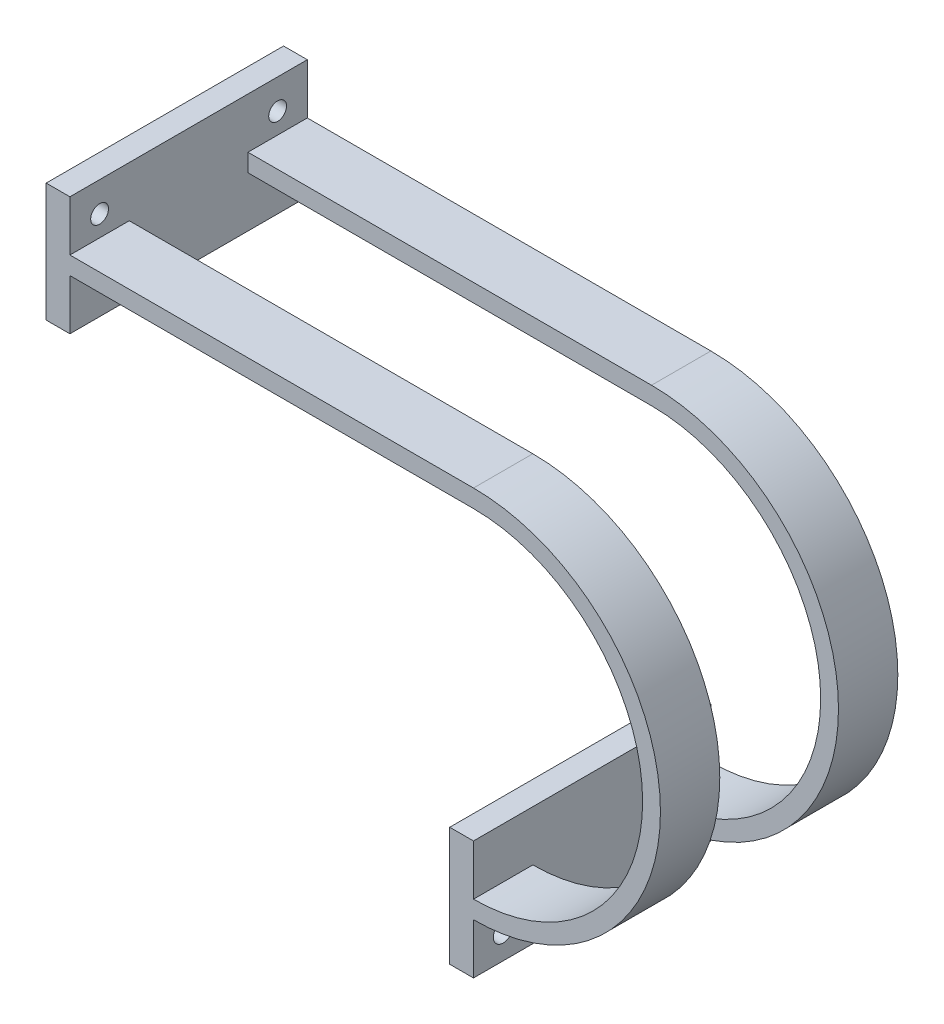
ISO-10303-21;
HEADER;
FILE_DESCRIPTION(('STEP AP214'),'2;1');
FILE_NAME('part.step','',(''),(''),'','','');
FILE_SCHEMA(('AUTOMOTIVE_DESIGN { 1 0 10303 214 1 1 1 1 }'));
ENDSEC;
DATA;
#1=APPLICATION_CONTEXT('core data for automotive mechanical design processes');
#2=APPLICATION_PROTOCOL_DEFINITION('international standard','automotive_design',2000,#1);
#3=PRODUCT_CONTEXT('',#1,'mechanical');
#4=PRODUCT('Part','Part','',(#3));
#5=PRODUCT_RELATED_PRODUCT_CATEGORY('part','',(#4));
#6=PRODUCT_DEFINITION_FORMATION('','',#4);
#7=PRODUCT_DEFINITION_CONTEXT('part definition',#1,'design');
#8=PRODUCT_DEFINITION('design','',#6,#7);
#9=PRODUCT_DEFINITION_SHAPE('','',#8);
#10=(LENGTH_UNIT() NAMED_UNIT(*) SI_UNIT(.MILLI.,.METRE.));
#11=(NAMED_UNIT(*) PLANE_ANGLE_UNIT() SI_UNIT($,.RADIAN.));
#12=(NAMED_UNIT(*) SI_UNIT($,.STERADIAN.) SOLID_ANGLE_UNIT());
#13=UNCERTAINTY_MEASURE_WITH_UNIT(LENGTH_MEASURE(1.E-05),#10,'distance_accuracy_value','');
#14=(GEOMETRIC_REPRESENTATION_CONTEXT(3) GLOBAL_UNCERTAINTY_ASSIGNED_CONTEXT((#13)) GLOBAL_UNIT_ASSIGNED_CONTEXT((#10,
#11,#12)) REPRESENTATION_CONTEXT('',''));
#15=CARTESIAN_POINT('',(0.,0.,0.));
#16=DIRECTION('',(0.,0.,1.));
#17=DIRECTION('',(1.,0.,0.));
#18=AXIS2_PLACEMENT_3D('',#15,#16,#17);
#19=CARTESIAN_POINT('',(139.59612732993,1607.92169688137,-1159.50626659985));
#20=DIRECTION('',(0.,0.,-1.));
#21=DIRECTION('',(-1.,0.,0.));
#22=AXIS2_PLACEMENT_3D('',#19,#20,#21);
#23=CYLINDRICAL_SURFACE('',#22,15.7499999999997);
#24=CARTESIAN_POINT('',(139.59612732993,1607.92169688137,-1209.72433724547));
#25=DIRECTION('',(0.,0.,-1.));
#26=DIRECTION('',(-1.,0.,0.));
#27=AXIS2_PLACEMENT_3D('',#24,#25,#26);
#28=CIRCLE('',#27,15.7499999999997);
#29=CARTESIAN_POINT('',(139.596127329932,1592.17169688137,-1209.72433724547));
#30=VERTEX_POINT('',#29);
#31=CARTESIAN_POINT('',(139.596127329932,1623.67169688137,-1209.72433724547));
#32=VERTEX_POINT('',#31);
#33=EDGE_CURVE('E186',#30,#32,#28,.F.);
#34=ORIENTED_EDGE('',*,*,#33,.F.);
#35=DIRECTION('',(0.,0.,-1.));
#36=VECTOR('',#35,1.);
#37=CARTESIAN_POINT('',(139.59612732993,1592.17169688137,-1159.50626659985));
#38=LINE('',#37,#36);
#39=CARTESIAN_POINT('',(139.59612732993,1592.17169688137,-1214.72433724547));
#40=VERTEX_POINT('',#39);
#41=EDGE_CURVE('E202',#30,#40,#38,.T.);
#42=ORIENTED_EDGE('',*,*,#41,.T.);
#43=CARTESIAN_POINT('',(139.59612732993,1607.92169688137,-1214.72433724547));
#44=DIRECTION('',(0.,0.,-1.));
#45=DIRECTION('',(1.,0.,0.));
#46=AXIS2_PLACEMENT_3D('',#43,#44,#45);
#47=CIRCLE('',#46,15.7499999999997);
#48=CARTESIAN_POINT('',(139.59612732993,1623.67169688137,-1214.72433724547));
#49=VERTEX_POINT('',#48);
#50=EDGE_CURVE('E333',#49,#40,#47,.T.);
#51=ORIENTED_EDGE('',*,*,#50,.F.);
#52=DIRECTION('',(0.,0.,1.));
#53=VECTOR('',#52,1.);
#54=CARTESIAN_POINT('',(139.59612732993,1623.67169688137,-1214.72433724547));
#55=LINE('',#54,#53);
#56=EDGE_CURVE('E264',#49,#32,#55,.T.);
#57=ORIENTED_EDGE('',*,*,#56,.T.);
#58=EDGE_LOOP('',(#34,#42,#51,#57));
#59=FACE_BOUND('',#58,.T.);
#60=ADVANCED_FACE('F41',(#59),#23,.T.);
#61=CARTESIAN_POINT('',(139.59612732993,1607.92169688137,-1159.50626659985));
#62=DIRECTION('',(0.,0.,-1.));
#63=DIRECTION('',(-1.,0.,0.));
#64=AXIS2_PLACEMENT_3D('',#61,#62,#63);
#65=CYLINDRICAL_SURFACE('',#64,14.2499999999999);
#66=CARTESIAN_POINT('',(139.59612732993,1607.92169688137,-1209.72433724547));
#67=DIRECTION('',(0.,0.,-1.));
#68=DIRECTION('',(-1.,0.,0.));
#69=AXIS2_PLACEMENT_3D('',#66,#67,#68);
#70=CIRCLE('',#69,14.2499999999999);
#71=CARTESIAN_POINT('',(139.596127329932,1622.17169688137,-1209.72433724547));
#72=VERTEX_POINT('',#71);
#73=CARTESIAN_POINT('',(139.596127329932,1593.67169688137,-1209.72433724547));
#74=VERTEX_POINT('',#73);
#75=EDGE_CURVE('E11',#72,#74,#70,.T.);
#76=ORIENTED_EDGE('',*,*,#75,.F.);
#77=DIRECTION('',(0.,0.,-1.));
#78=VECTOR('',#77,1.);
#79=CARTESIAN_POINT('',(139.59612732993,1622.17169688137,-1214.72433724547));
#80=LINE('',#79,#78);
#81=CARTESIAN_POINT('',(139.59612732993,1622.17169688137,-1214.72433724547));
#82=VERTEX_POINT('',#81);
#83=EDGE_CURVE('E297',#72,#82,#80,.T.);
#84=ORIENTED_EDGE('',*,*,#83,.T.);
#85=CARTESIAN_POINT('',(139.59612732993,1607.92169688137,-1214.72433724547));
#86=DIRECTION('',(0.,0.,1.));
#87=DIRECTION('',(1.,0.,0.));
#88=AXIS2_PLACEMENT_3D('',#85,#86,#87);
#89=CIRCLE('',#88,14.2499999999999);
#90=CARTESIAN_POINT('',(139.59612732993,1593.67169688137,-1214.72433724547));
#91=VERTEX_POINT('',#90);
#92=EDGE_CURVE('E207',#91,#82,#89,.T.);
#93=ORIENTED_EDGE('',*,*,#92,.F.);
#94=DIRECTION('',(0.,0.,-1.));
#95=VECTOR('',#94,1.);
#96=CARTESIAN_POINT('',(139.59612732993,1593.67169688137,-1159.50626659985));
#97=LINE('',#96,#95);
#98=EDGE_CURVE('E66',#74,#91,#97,.T.);
#99=ORIENTED_EDGE('',*,*,#98,.F.);
#100=EDGE_LOOP('',(#76,#84,#93,#99));
#101=FACE_BOUND('',#100,.T.);
#102=ADVANCED_FACE('F406',(#101),#65,.F.);
#103=CARTESIAN_POINT('',(139.59612732993,1587.92169688137,-1194.72433724547));
#104=DIRECTION('',(0.,0.,-1.));
#105=DIRECTION('',(-1.,0.,0.));
#106=AXIS2_PLACEMENT_3D('',#103,#104,#105);
#107=PLANE('',#106);
#108=DIRECTION('',(0.,-1.,0.));
#109=VECTOR('',#108,1.);
#110=CARTESIAN_POINT('',(137.59612732993,1587.92169688137,-1194.72433724547));
#111=LINE('',#110,#109);
#112=CARTESIAN_POINT('',(137.59612732993,1597.92169688137,-1194.72433724547));
#113=VERTEX_POINT('',#112);
#114=CARTESIAN_POINT('',(137.59612732993,1587.92169688137,-1194.72433724547));
#115=VERTEX_POINT('',#114);
#116=EDGE_CURVE('E222',#113,#115,#111,.T.);
#117=ORIENTED_EDGE('',*,*,#116,.T.);
#118=DIRECTION('',(-1.,0.,0.));
#119=VECTOR('',#118,1.);
#120=CARTESIAN_POINT('',(139.59612732993,1587.92169688137,-1194.72433724547));
#121=LINE('',#120,#119);
#122=CARTESIAN_POINT('',(139.59612732993,1587.92169688137,-1194.72433724547));
#123=VERTEX_POINT('',#122);
#124=EDGE_CURVE('E239',#123,#115,#121,.T.);
#125=ORIENTED_EDGE('',*,*,#124,.F.);
#126=DIRECTION('',(0.,-1.,0.));
#127=VECTOR('',#126,1.);
#128=CARTESIAN_POINT('',(139.59612732993,1587.92169688137,-1194.72433724547));
#129=LINE('',#128,#127);
#130=CARTESIAN_POINT('',(139.59612732993,1592.17169688137,-1194.72433724547));
#131=VERTEX_POINT('',#130);
#132=EDGE_CURVE('E212',#131,#123,#129,.T.);
#133=ORIENTED_EDGE('',*,*,#132,.F.);
#134=CARTESIAN_POINT('',(139.59612732993,1607.92169688137,-1194.72433724547));
#135=DIRECTION('',(0.,0.,-1.));
#136=DIRECTION('',(-1.,0.,0.));
#137=AXIS2_PLACEMENT_3D('',#134,#135,#136);
#138=CIRCLE('',#137,15.7499999999997);
#139=CARTESIAN_POINT('',(139.59612732993,1623.67169688137,-1194.72433724547));
#140=VERTEX_POINT('',#139);
#141=EDGE_CURVE('E205',#131,#140,#138,.F.);
#142=ORIENTED_EDGE('',*,*,#141,.T.);
#143=DIRECTION('',(1.,0.,0.));
#144=VECTOR('',#143,1.);
#145=CARTESIAN_POINT('',(100.375974075477,1623.67169688137,-1194.72433724547));
#146=LINE('',#145,#144);
#147=CARTESIAN_POINT('',(105.596127329933,1623.67169688137,-1194.72433724547));
#148=VERTEX_POINT('',#147);
#149=EDGE_CURVE('E268',#148,#140,#146,.T.);
#150=ORIENTED_EDGE('',*,*,#149,.F.);
#151=DIRECTION('',(0.,-1.,0.));
#152=VECTOR('',#151,1.);
#153=CARTESIAN_POINT('',(105.596127329933,1617.92169688137,-1194.72433724547));
#154=LINE('',#153,#152);
#155=CARTESIAN_POINT('',(105.596127329933,1627.92169688137,-1194.72433724547));
#156=VERTEX_POINT('',#155);
#157=EDGE_CURVE('E310',#156,#148,#154,.T.);
#158=ORIENTED_EDGE('',*,*,#157,.F.);
#159=DIRECTION('',(-1.,0.,0.));
#160=VECTOR('',#159,1.);
#161=CARTESIAN_POINT('',(105.596127329933,1627.92169688137,-1194.72433724547));
#162=LINE('',#161,#160);
#163=CARTESIAN_POINT('',(103.596127329933,1627.92169688137,-1194.72433724547));
#164=VERTEX_POINT('',#163);
#165=EDGE_CURVE('E323',#156,#164,#162,.T.);
#166=ORIENTED_EDGE('',*,*,#165,.T.);
#167=DIRECTION('',(0.,-1.,0.));
#168=VECTOR('',#167,1.);
#169=CARTESIAN_POINT('',(103.596127329933,1617.92169688137,-1194.72433724547));
#170=LINE('',#169,#168);
#171=CARTESIAN_POINT('',(103.596127329933,1617.92169688137,-1194.72433724547));
#172=VERTEX_POINT('',#171);
#173=EDGE_CURVE('E316',#164,#172,#170,.T.);
#174=ORIENTED_EDGE('',*,*,#173,.T.);
#175=DIRECTION('',(-1.,0.,0.));
#176=VECTOR('',#175,1.);
#177=CARTESIAN_POINT('',(105.596127329933,1617.92169688137,-1194.72433724547));
#178=LINE('',#177,#176);
#179=CARTESIAN_POINT('',(105.596127329933,1617.92169688137,-1194.72433724547));
#180=VERTEX_POINT('',#179);
#181=EDGE_CURVE('E325',#180,#172,#178,.T.);
#182=ORIENTED_EDGE('',*,*,#181,.F.);
#183=CARTESIAN_POINT('',(105.596127329933,1622.17169688137,-1194.72433724547));
#184=VERTEX_POINT('',#183);
#185=EDGE_CURVE('E307',#184,#180,#154,.T.);
#186=ORIENTED_EDGE('',*,*,#185,.F.);
#187=DIRECTION('',(1.,0.,0.));
#188=VECTOR('',#187,1.);
#189=CARTESIAN_POINT('',(100.375974075477,1622.17169688137,-1194.72433724547));
#190=LINE('',#189,#188);
#191=CARTESIAN_POINT('',(139.59612732993,1622.17169688137,-1194.72433724547));
#192=VERTEX_POINT('',#191);
#193=EDGE_CURVE('E275',#184,#192,#190,.T.);
#194=ORIENTED_EDGE('',*,*,#193,.T.);
#195=CARTESIAN_POINT('',(139.59612732993,1607.92169688137,-1194.72433724547));
#196=DIRECTION('',(0.,0.,-1.));
#197=DIRECTION('',(-1.,0.,0.));
#198=AXIS2_PLACEMENT_3D('',#195,#196,#197);
#199=CIRCLE('',#198,14.2499999999999);
#200=CARTESIAN_POINT('',(139.59612732993,1593.67169688137,-1194.72433724547));
#201=VERTEX_POINT('',#200);
#202=EDGE_CURVE('E332',#192,#201,#199,.T.);
#203=ORIENTED_EDGE('',*,*,#202,.T.);
#204=CARTESIAN_POINT('',(139.59612732993,1597.92169688137,-1194.72433724547));
#205=VERTEX_POINT('',#204);
#206=EDGE_CURVE('E206',#205,#201,#129,.T.);
#207=ORIENTED_EDGE('',*,*,#206,.F.);
#208=DIRECTION('',(-1.,0.,0.));
#209=VECTOR('',#208,1.);
#210=CARTESIAN_POINT('',(139.59612732993,1597.92169688137,-1194.72433724547));
#211=LINE('',#210,#209);
#212=EDGE_CURVE('E219',#205,#113,#211,.T.);
#213=ORIENTED_EDGE('',*,*,#212,.T.);
#214=EDGE_LOOP('',(#117,#125,#133,#142,#150,#158,#166,#174,#182,#186,#194,#203,#207,#213));
#215=FACE_BOUND('',#214,.T.);
#216=ADVANCED_FACE('F43',(#215),#107,.F.);
#217=CARTESIAN_POINT('',(139.59612732993,1587.92169688137,-1214.72433724547));
#218=DIRECTION('',(0.,1.,0.));
#219=DIRECTION('',(0.,0.,1.));
#220=AXIS2_PLACEMENT_3D('',#217,#218,#219);
#221=PLANE('',#220);
#222=DIRECTION('',(0.,0.,-1.));
#223=VECTOR('',#222,1.);
#224=CARTESIAN_POINT('',(137.59612732993,1587.92169688137,-1214.72433724547));
#225=LINE('',#224,#223);
#226=CARTESIAN_POINT('',(137.59612732993,1587.92169688137,-1214.72433724547));
#227=VERTEX_POINT('',#226);
#228=EDGE_CURVE('E221',#115,#227,#225,.T.);
#229=ORIENTED_EDGE('',*,*,#228,.T.);
#230=DIRECTION('',(-1.,0.,0.));
#231=VECTOR('',#230,1.);
#232=CARTESIAN_POINT('',(139.59612732993,1587.92169688137,-1214.72433724547));
#233=LINE('',#232,#231);
#234=CARTESIAN_POINT('',(139.59612732993,1587.92169688137,-1214.72433724547));
#235=VERTEX_POINT('',#234);
#236=EDGE_CURVE('E233',#235,#227,#233,.T.);
#237=ORIENTED_EDGE('',*,*,#236,.F.);
#238=DIRECTION('',(0.,0.,-1.));
#239=VECTOR('',#238,1.);
#240=CARTESIAN_POINT('',(139.59612732993,1587.92169688137,-1214.72433724547));
#241=LINE('',#240,#239);
#242=EDGE_CURVE('E211',#123,#235,#241,.T.);
#243=ORIENTED_EDGE('',*,*,#242,.F.);
#244=ORIENTED_EDGE('',*,*,#124,.T.);
#245=EDGE_LOOP('',(#229,#237,#243,#244));
#246=FACE_BOUND('',#245,.T.);
#247=ADVANCED_FACE('F362',(#246),#221,.F.);
#248=CARTESIAN_POINT('',(139.59612732993,1587.92169688137,-1214.72433724547));
#249=DIRECTION('',(0.,0.,1.));
#250=DIRECTION('',(1.,0.,0.));
#251=AXIS2_PLACEMENT_3D('',#248,#249,#250);
#252=PLANE('',#251);
#253=DIRECTION('',(0.,1.,0.));
#254=VECTOR('',#253,1.);
#255=CARTESIAN_POINT('',(137.59612732993,1587.92169688137,-1214.72433724547));
#256=LINE('',#255,#254);
#257=CARTESIAN_POINT('',(137.59612732993,1597.92169688137,-1214.72433724547));
#258=VERTEX_POINT('',#257);
#259=EDGE_CURVE('E227',#227,#258,#256,.T.);
#260=ORIENTED_EDGE('',*,*,#259,.T.);
#261=DIRECTION('',(-1.,0.,0.));
#262=VECTOR('',#261,1.);
#263=CARTESIAN_POINT('',(139.59612732993,1597.92169688137,-1214.72433724547));
#264=LINE('',#263,#262);
#265=CARTESIAN_POINT('',(139.59612732993,1597.92169688137,-1214.72433724547));
#266=VERTEX_POINT('',#265);
#267=EDGE_CURVE('E235',#266,#258,#264,.T.);
#268=ORIENTED_EDGE('',*,*,#267,.F.);
#269=DIRECTION('',(0.,1.,0.));
#270=VECTOR('',#269,1.);
#271=CARTESIAN_POINT('',(139.59612732993,1587.92169688137,-1214.72433724547));
#272=LINE('',#271,#270);
#273=EDGE_CURVE('E213',#91,#266,#272,.T.);
#274=ORIENTED_EDGE('',*,*,#273,.F.);
#275=ORIENTED_EDGE('',*,*,#92,.T.);
#276=DIRECTION('',(1.,0.,0.));
#277=VECTOR('',#276,1.);
#278=CARTESIAN_POINT('',(100.375974075477,1622.17169688137,-1214.72433724547));
#279=LINE('',#278,#277);
#280=CARTESIAN_POINT('',(105.596127329933,1622.17169688137,-1214.72433724547));
#281=VERTEX_POINT('',#280);
#282=EDGE_CURVE('E278',#281,#82,#279,.T.);
#283=ORIENTED_EDGE('',*,*,#282,.F.);
#284=DIRECTION('',(0.,1.,0.));
#285=VECTOR('',#284,1.);
#286=CARTESIAN_POINT('',(105.596127329933,1617.92169688137,-1214.72433724547));
#287=LINE('',#286,#285);
#288=CARTESIAN_POINT('',(105.596127329933,1617.92169688137,-1214.72433724547));
#289=VERTEX_POINT('',#288);
#290=EDGE_CURVE('E302',#289,#281,#287,.T.);
#291=ORIENTED_EDGE('',*,*,#290,.F.);
#292=DIRECTION('',(-1.,0.,0.));
#293=VECTOR('',#292,1.);
#294=CARTESIAN_POINT('',(105.596127329933,1617.92169688137,-1214.72433724547));
#295=LINE('',#294,#293);
#296=CARTESIAN_POINT('',(103.596127329933,1617.92169688137,-1214.72433724547));
#297=VERTEX_POINT('',#296);
#298=EDGE_CURVE('E311',#289,#297,#295,.T.);
#299=ORIENTED_EDGE('',*,*,#298,.T.);
#300=DIRECTION('',(0.,1.,0.));
#301=VECTOR('',#300,1.);
#302=CARTESIAN_POINT('',(103.596127329933,1617.92169688137,-1214.72433724547));
#303=LINE('',#302,#301);
#304=CARTESIAN_POINT('',(103.596127329933,1627.92169688137,-1214.72433724547));
#305=VERTEX_POINT('',#304);
#306=EDGE_CURVE('E280',#297,#305,#303,.T.);
#307=ORIENTED_EDGE('',*,*,#306,.T.);
#308=DIRECTION('',(-1.,0.,0.));
#309=VECTOR('',#308,1.);
#310=CARTESIAN_POINT('',(105.596127329933,1627.92169688137,-1214.72433724547));
#311=LINE('',#310,#309);
#312=CARTESIAN_POINT('',(105.596127329933,1627.92169688137,-1214.72433724547));
#313=VERTEX_POINT('',#312);
#314=EDGE_CURVE('E328',#313,#305,#311,.T.);
#315=ORIENTED_EDGE('',*,*,#314,.F.);
#316=CARTESIAN_POINT('',(105.596127329933,1623.67169688137,-1214.72433724547));
#317=VERTEX_POINT('',#316);
#318=EDGE_CURVE('E304',#317,#313,#287,.T.);
#319=ORIENTED_EDGE('',*,*,#318,.F.);
#320=DIRECTION('',(1.,0.,0.));
#321=VECTOR('',#320,1.);
#322=CARTESIAN_POINT('',(100.375974075477,1623.67169688137,-1214.72433724547));
#323=LINE('',#322,#321);
#324=EDGE_CURVE('E260',#317,#49,#323,.T.);
#325=ORIENTED_EDGE('',*,*,#324,.T.);
#326=ORIENTED_EDGE('',*,*,#50,.T.);
#327=EDGE_CURVE('E215',#235,#40,#272,.T.);
#328=ORIENTED_EDGE('',*,*,#327,.F.);
#329=ORIENTED_EDGE('',*,*,#236,.T.);
#330=EDGE_LOOP('',(#260,#268,#274,#275,#283,#291,#299,#307,#315,#319,#325,#326,#328,#329));
#331=FACE_BOUND('',#330,.T.);
#332=ADVANCED_FACE('F366',(#331),#252,.F.);
#333=CARTESIAN_POINT('',(139.59612732993,1597.92169688137,-1214.72433724547));
#334=DIRECTION('',(0.,-1.,0.));
#335=DIRECTION('',(0.,0.,-1.));
#336=AXIS2_PLACEMENT_3D('',#333,#334,#335);
#337=PLANE('',#336);
#338=DIRECTION('',(0.,0.,1.));
#339=VECTOR('',#338,1.);
#340=CARTESIAN_POINT('',(137.59612732993,1597.92169688137,-1214.72433724547));
#341=LINE('',#340,#339);
#342=EDGE_CURVE('E228',#258,#113,#341,.T.);
#343=ORIENTED_EDGE('',*,*,#342,.T.);
#344=ORIENTED_EDGE('',*,*,#212,.F.);
#345=DIRECTION('',(0.,0.,1.));
#346=VECTOR('',#345,1.);
#347=CARTESIAN_POINT('',(139.59612732993,1597.92169688137,-1214.72433724547));
#348=LINE('',#347,#346);
#349=EDGE_CURVE('E217',#266,#205,#348,.T.);
#350=ORIENTED_EDGE('',*,*,#349,.F.);
#351=ORIENTED_EDGE('',*,*,#267,.T.);
#352=EDGE_LOOP('',(#343,#344,#350,#351));
#353=FACE_BOUND('',#352,.T.);
#354=ADVANCED_FACE('F405',(#353),#337,.F.);
#355=CARTESIAN_POINT('',(139.59612732993,0.,0.));
#356=DIRECTION('',(1.,0.,0.));
#357=DIRECTION('',(0.,0.,-1.));
#358=AXIS2_PLACEMENT_3D('',#355,#356,#357);
#359=PLANE('',#358);
#360=CARTESIAN_POINT('',(139.59612732993,1590.04669688137,-1197.22433724547));
#361=DIRECTION('',(1.,0.,0.));
#362=DIRECTION('',(0.,0.,-1.));
#363=AXIS2_PLACEMENT_3D('',#360,#361,#362);
#364=CIRCLE('',#363,0.825000000000161);
#365=CARTESIAN_POINT('',(139.59612732993,1590.04669688137,-1198.04933724547));
#366=VERTEX_POINT('',#365);
#367=EDGE_CURVE('E242',#366,#366,#364,.T.);
#368=ORIENTED_EDGE('',*,*,#367,.F.);
#369=EDGE_LOOP('',(#368));
#370=FACE_BOUND('',#369,.T.);
#371=CARTESIAN_POINT('',(139.59612732993,1590.04669688137,-1212.22433724547));
#372=DIRECTION('',(1.,0.,0.));
#373=DIRECTION('',(0.,0.,-1.));
#374=AXIS2_PLACEMENT_3D('',#371,#372,#373);
#375=CIRCLE('',#374,0.825000000000161);
#376=CARTESIAN_POINT('',(139.59612732993,1590.04669688137,-1213.04933724547));
#377=VERTEX_POINT('',#376);
#378=EDGE_CURVE('E249',#377,#377,#375,.T.);
#379=ORIENTED_EDGE('',*,*,#378,.F.);
#380=EDGE_LOOP('',(#379));
#381=FACE_BOUND('',#380,.T.);
#382=ORIENTED_EDGE('',*,*,#41,.F.);
#383=DIRECTION('',(0.,1.,0.));
#384=VECTOR('',#383,1.);
#385=CARTESIAN_POINT('',(139.596127329932,1577.92169688137,-1209.72433724547));
#386=LINE('',#385,#384);
#387=EDGE_CURVE('E189',#30,#74,#386,.T.);
#388=ORIENTED_EDGE('',*,*,#387,.T.);
#389=ORIENTED_EDGE('',*,*,#98,.T.);
#390=ORIENTED_EDGE('',*,*,#273,.T.);
#391=ORIENTED_EDGE('',*,*,#349,.T.);
#392=ORIENTED_EDGE('',*,*,#206,.T.);
#393=CARTESIAN_POINT('',(139.59612732993,1593.67169688137,-1199.72433724547));
#394=VERTEX_POINT('',#393);
#395=EDGE_CURVE('E200',#201,#394,#97,.T.);
#396=ORIENTED_EDGE('',*,*,#395,.T.);
#397=DIRECTION('',(0.,1.,0.));
#398=VECTOR('',#397,1.);
#399=CARTESIAN_POINT('',(139.596127329932,1577.92169688137,-1199.72433724547));
#400=LINE('',#399,#398);
#401=CARTESIAN_POINT('',(139.596127329932,1592.17169688137,-1199.72433724547));
#402=VERTEX_POINT('',#401);
#403=EDGE_CURVE('E59',#402,#394,#400,.T.);
#404=ORIENTED_EDGE('',*,*,#403,.F.);
#405=EDGE_CURVE('E192',#131,#402,#38,.T.);
#406=ORIENTED_EDGE('',*,*,#405,.F.);
#407=ORIENTED_EDGE('',*,*,#132,.T.);
#408=ORIENTED_EDGE('',*,*,#242,.T.);
#409=ORIENTED_EDGE('',*,*,#327,.T.);
#410=EDGE_LOOP('',(#382,#388,#389,#390,#391,#392,#396,#404,#406,#407,#408,#409));
#411=FACE_BOUND('',#410,.T.);
#412=ADVANCED_FACE('F193',(#370,#381,#411),#359,.T.);
#413=CARTESIAN_POINT('',(137.59612732993,0.,0.));
#414=DIRECTION('',(1.,0.,0.));
#415=DIRECTION('',(0.,0.,-1.));
#416=AXIS2_PLACEMENT_3D('',#413,#414,#415);
#417=PLANE('',#416);
#418=CARTESIAN_POINT('',(137.59612732993,1590.04669688137,-1197.22433724547));
#419=DIRECTION('',(1.,0.,0.));
#420=DIRECTION('',(0.,0.,-1.));
#421=AXIS2_PLACEMENT_3D('',#418,#419,#420);
#422=CIRCLE('',#421,0.825000000000161);
#423=CARTESIAN_POINT('',(137.59612732993,1590.04669688137,-1198.04933724547));
#424=VERTEX_POINT('',#423);
#425=EDGE_CURVE('E44',#424,#424,#422,.T.);
#426=ORIENTED_EDGE('',*,*,#425,.T.);
#427=EDGE_LOOP('',(#426));
#428=FACE_BOUND('',#427,.T.);
#429=CARTESIAN_POINT('',(137.59612732993,1590.04669688137,-1212.22433724547));
#430=DIRECTION('',(1.,0.,0.));
#431=DIRECTION('',(0.,0.,-1.));
#432=AXIS2_PLACEMENT_3D('',#429,#430,#431);
#433=CIRCLE('',#432,0.825000000000161);
#434=CARTESIAN_POINT('',(137.59612732993,1590.04669688137,-1213.04933724547));
#435=VERTEX_POINT('',#434);
#436=EDGE_CURVE('E241',#435,#435,#433,.T.);
#437=ORIENTED_EDGE('',*,*,#436,.T.);
#438=EDGE_LOOP('',(#437));
#439=FACE_BOUND('',#438,.T.);
#440=ORIENTED_EDGE('',*,*,#116,.F.);
#441=ORIENTED_EDGE('',*,*,#342,.F.);
#442=ORIENTED_EDGE('',*,*,#259,.F.);
#443=ORIENTED_EDGE('',*,*,#228,.F.);
#444=EDGE_LOOP('',(#440,#441,#442,#443));
#445=FACE_BOUND('',#444,.T.);
#446=ADVANCED_FACE('F401',(#428,#439,#445),#417,.F.);
#447=CARTESIAN_POINT('',(139.59612732993,1607.92169688137,-1199.72433724547));
#448=DIRECTION('',(0.,0.,1.));
#449=DIRECTION('',(1.,0.,0.));
#450=AXIS2_PLACEMENT_3D('',#447,#448,#449);
#451=CIRCLE('',#450,15.7499999999997);
#452=CARTESIAN_POINT('',(139.596127329932,1623.67169688137,-1199.72433724547));
#453=VERTEX_POINT('',#452);
#454=EDGE_CURVE('E178',#453,#402,#451,.F.);
#455=ORIENTED_EDGE('',*,*,#454,.F.);
#456=DIRECTION('',(0.,0.,-1.));
#457=VECTOR('',#456,1.);
#458=CARTESIAN_POINT('',(139.59612732993,1623.67169688137,-1159.50626659985));
#459=LINE('',#458,#457);
#460=EDGE_CURVE('E334',#140,#453,#459,.T.);
#461=ORIENTED_EDGE('',*,*,#460,.F.);
#462=ORIENTED_EDGE('',*,*,#141,.F.);
#463=ORIENTED_EDGE('',*,*,#405,.T.);
#464=EDGE_LOOP('',(#455,#461,#462,#463));
#465=FACE_BOUND('',#464,.T.);
#466=ADVANCED_FACE('F199',(#465),#23,.T.);
#467=CARTESIAN_POINT('',(139.59612732993,1607.92169688137,-1199.72433724547));
#468=DIRECTION('',(0.,0.,1.));
#469=DIRECTION('',(1.,0.,0.));
#470=AXIS2_PLACEMENT_3D('',#467,#468,#469);
#471=CIRCLE('',#470,14.2499999999999);
#472=CARTESIAN_POINT('',(139.596127329932,1622.17169688137,-1199.72433724547));
#473=VERTEX_POINT('',#472);
#474=EDGE_CURVE('E49',#394,#473,#471,.T.);
#475=ORIENTED_EDGE('',*,*,#474,.F.);
#476=ORIENTED_EDGE('',*,*,#395,.F.);
#477=ORIENTED_EDGE('',*,*,#202,.F.);
#478=DIRECTION('',(0.,0.,-1.));
#479=VECTOR('',#478,1.);
#480=CARTESIAN_POINT('',(139.59612732993,1622.17169688137,-1159.50626659985));
#481=LINE('',#480,#479);
#482=EDGE_CURVE('E341',#192,#473,#481,.T.);
#483=ORIENTED_EDGE('',*,*,#482,.T.);
#484=EDGE_LOOP('',(#475,#476,#477,#483));
#485=FACE_BOUND('',#484,.T.);
#486=ADVANCED_FACE('F346',(#485),#65,.F.);
#487=CARTESIAN_POINT('',(105.596127329933,0.,0.));
#488=DIRECTION('',(-1.,0.,0.));
#489=DIRECTION('',(0.,0.,1.));
#490=AXIS2_PLACEMENT_3D('',#487,#488,#489);
#491=PLANE('',#490);
#492=CARTESIAN_POINT('',(105.596127329933,1625.42169688137,-1197.22433724547));
#493=DIRECTION('',(1.,0.,0.));
#494=DIRECTION('',(0.,0.,-1.));
#495=AXIS2_PLACEMENT_3D('',#492,#493,#494);
#496=CIRCLE('',#495,0.750000000000022);
#497=CARTESIAN_POINT('',(105.596127329933,1625.42169688137,-1197.97433724547));
#498=VERTEX_POINT('',#497);
#499=EDGE_CURVE('E588',#498,#498,#496,.T.);
#500=ORIENTED_EDGE('',*,*,#499,.F.);
#501=EDGE_LOOP('',(#500));
#502=FACE_BOUND('',#501,.T.);
#503=CARTESIAN_POINT('',(105.596127329933,1625.42169688137,-1212.22433724547));
#504=DIRECTION('',(1.,0.,0.));
#505=DIRECTION('',(0.,0.,-1.));
#506=AXIS2_PLACEMENT_3D('',#503,#504,#505);
#507=CIRCLE('',#506,0.750000000000022);
#508=CARTESIAN_POINT('',(105.596127329933,1625.42169688137,-1212.97433724547));
#509=VERTEX_POINT('',#508);
#510=EDGE_CURVE('E591',#509,#509,#507,.T.);
#511=ORIENTED_EDGE('',*,*,#510,.F.);
#512=EDGE_LOOP('',(#511));
#513=FACE_BOUND('',#512,.T.);
#514=DIRECTION('',(0.,0.,1.));
#515=VECTOR('',#514,1.);
#516=CARTESIAN_POINT('',(105.596127329933,1623.67169688137,-1194.72433724547));
#517=LINE('',#516,#515);
#518=CARTESIAN_POINT('',(105.596127329933,1623.67169688137,-1199.72433724547));
#519=VERTEX_POINT('',#518);
#520=EDGE_CURVE('E262',#519,#148,#517,.T.);
#521=ORIENTED_EDGE('',*,*,#520,.F.);
#522=DIRECTION('',(0.,1.,1.48029736616682E-13));
#523=VECTOR('',#522,1.);
#524=CARTESIAN_POINT('',(105.596127329933,1623.67169688137,-1199.72433724547));
#525=LINE('',#524,#523);
#526=CARTESIAN_POINT('',(105.596127329933,1622.17169688137,-1199.72433724547));
#527=VERTEX_POINT('',#526);
#528=EDGE_CURVE('E267',#527,#519,#525,.T.);
#529=ORIENTED_EDGE('',*,*,#528,.F.);
#530=DIRECTION('',(0.,0.,-1.));
#531=VECTOR('',#530,1.);
#532=CARTESIAN_POINT('',(105.596127329933,1622.17169688137,-1194.72433724547));
#533=LINE('',#532,#531);
#534=EDGE_CURVE('E259',#184,#527,#533,.T.);
#535=ORIENTED_EDGE('',*,*,#534,.F.);
#536=ORIENTED_EDGE('',*,*,#185,.T.);
#537=DIRECTION('',(0.,0.,-1.));
#538=VECTOR('',#537,1.);
#539=CARTESIAN_POINT('',(105.596127329933,1617.92169688137,-1194.72433724547));
#540=LINE('',#539,#538);
#541=EDGE_CURVE('E309',#180,#289,#540,.T.);
#542=ORIENTED_EDGE('',*,*,#541,.T.);
#543=ORIENTED_EDGE('',*,*,#290,.T.);
#544=DIRECTION('',(0.,0.,-1.));
#545=VECTOR('',#544,1.);
#546=CARTESIAN_POINT('',(105.596127329933,1622.17169688137,-1214.72433724547));
#547=LINE('',#546,#545);
#548=CARTESIAN_POINT('',(105.596127329933,1622.17169688137,-1209.72433724547));
#549=VERTEX_POINT('',#548);
#550=EDGE_CURVE('E289',#549,#281,#547,.T.);
#551=ORIENTED_EDGE('',*,*,#550,.F.);
#552=DIRECTION('',(0.,-1.,0.));
#553=VECTOR('',#552,1.);
#554=CARTESIAN_POINT('',(105.596127329933,1623.67169688137,-1209.72433724547));
#555=LINE('',#554,#553);
#556=CARTESIAN_POINT('',(105.596127329933,1623.67169688137,-1209.72433724547));
#557=VERTEX_POINT('',#556);
#558=EDGE_CURVE('E281',#557,#549,#555,.T.);
#559=ORIENTED_EDGE('',*,*,#558,.F.);
#560=DIRECTION('',(0.,0.,1.));
#561=VECTOR('',#560,1.);
#562=CARTESIAN_POINT('',(105.596127329933,1623.67169688137,-1214.72433724547));
#563=LINE('',#562,#561);
#564=EDGE_CURVE('E284',#317,#557,#563,.T.);
#565=ORIENTED_EDGE('',*,*,#564,.F.);
#566=ORIENTED_EDGE('',*,*,#318,.T.);
#567=DIRECTION('',(0.,0.,1.));
#568=VECTOR('',#567,1.);
#569=CARTESIAN_POINT('',(105.596127329933,1627.92169688137,-1194.72433724547));
#570=LINE('',#569,#568);
#571=EDGE_CURVE('E303',#313,#156,#570,.T.);
#572=ORIENTED_EDGE('',*,*,#571,.T.);
#573=ORIENTED_EDGE('',*,*,#157,.T.);
#574=EDGE_LOOP('',(#521,#529,#535,#536,#542,#543,#551,#559,#565,#566,#572,#573));
#575=FACE_BOUND('',#574,.T.);
#576=ADVANCED_FACE('F351',(#502,#513,#575),#491,.F.);
#577=CARTESIAN_POINT('',(105.596127329933,1627.92169688137,-1194.72433724547));
#578=DIRECTION('',(0.,-1.,0.));
#579=DIRECTION('',(0.,0.,-1.));
#580=AXIS2_PLACEMENT_3D('',#577,#578,#579);
#581=PLANE('',#580);
#582=DIRECTION('',(0.,0.,1.));
#583=VECTOR('',#582,1.);
#584=CARTESIAN_POINT('',(103.596127329933,1627.92169688137,-1194.72433724547));
#585=LINE('',#584,#583);
#586=EDGE_CURVE('E313',#305,#164,#585,.T.);
#587=ORIENTED_EDGE('',*,*,#586,.T.);
#588=ORIENTED_EDGE('',*,*,#165,.F.);
#589=ORIENTED_EDGE('',*,*,#571,.F.);
#590=ORIENTED_EDGE('',*,*,#314,.T.);
#591=EDGE_LOOP('',(#587,#588,#589,#590));
#592=FACE_BOUND('',#591,.T.);
#593=ADVANCED_FACE('F385',(#592),#581,.F.);
#594=CARTESIAN_POINT('',(105.596127329933,1617.92169688137,-1194.72433724547));
#595=DIRECTION('',(0.,1.,0.));
#596=DIRECTION('',(0.,0.,1.));
#597=AXIS2_PLACEMENT_3D('',#594,#595,#596);
#598=PLANE('',#597);
#599=DIRECTION('',(0.,0.,-1.));
#600=VECTOR('',#599,1.);
#601=CARTESIAN_POINT('',(103.596127329933,1617.92169688137,-1194.72433724547));
#602=LINE('',#601,#600);
#603=EDGE_CURVE('E317',#172,#297,#602,.T.);
#604=ORIENTED_EDGE('',*,*,#603,.T.);
#605=ORIENTED_EDGE('',*,*,#298,.F.);
#606=ORIENTED_EDGE('',*,*,#541,.F.);
#607=ORIENTED_EDGE('',*,*,#181,.T.);
#608=EDGE_LOOP('',(#604,#605,#606,#607));
#609=FACE_BOUND('',#608,.T.);
#610=ADVANCED_FACE('F391',(#609),#598,.F.);
#611=CARTESIAN_POINT('',(103.596127329933,0.,0.));
#612=DIRECTION('',(-1.,0.,0.));
#613=DIRECTION('',(0.,0.,1.));
#614=AXIS2_PLACEMENT_3D('',#611,#612,#613);
#615=PLANE('',#614);
#616=CARTESIAN_POINT('',(103.596127329933,1625.42169688137,-1197.22433724547));
#617=DIRECTION('',(1.,0.,0.));
#618=DIRECTION('',(0.,0.,-1.));
#619=AXIS2_PLACEMENT_3D('',#616,#617,#618);
#620=CIRCLE('',#619,0.750000000000022);
#621=CARTESIAN_POINT('',(103.596127329933,1625.42169688137,-1197.97433724547));
#622=VERTEX_POINT('',#621);
#623=EDGE_CURVE('E253',#622,#622,#620,.T.);
#624=ORIENTED_EDGE('',*,*,#623,.T.);
#625=EDGE_LOOP('',(#624));
#626=FACE_BOUND('',#625,.T.);
#627=CARTESIAN_POINT('',(103.596127329933,1625.42169688137,-1212.22433724547));
#628=DIRECTION('',(1.,0.,0.));
#629=DIRECTION('',(0.,0.,-1.));
#630=AXIS2_PLACEMENT_3D('',#627,#628,#629);
#631=CIRCLE('',#630,0.750000000000022);
#632=CARTESIAN_POINT('',(103.596127329933,1625.42169688137,-1212.97433724547));
#633=VERTEX_POINT('',#632);
#634=EDGE_CURVE('E594',#633,#633,#631,.T.);
#635=ORIENTED_EDGE('',*,*,#634,.T.);
#636=EDGE_LOOP('',(#635));
#637=FACE_BOUND('',#636,.T.);
#638=ORIENTED_EDGE('',*,*,#306,.F.);
#639=ORIENTED_EDGE('',*,*,#603,.F.);
#640=ORIENTED_EDGE('',*,*,#173,.F.);
#641=ORIENTED_EDGE('',*,*,#586,.F.);
#642=EDGE_LOOP('',(#638,#639,#640,#641));
#643=FACE_BOUND('',#642,.T.);
#644=ADVANCED_FACE('F389',(#626,#637,#643),#615,.T.);
#645=CARTESIAN_POINT('',(100.375974075477,1623.67169688137,-1214.72433724547));
#646=DIRECTION('',(0.,1.,0.));
#647=DIRECTION('',(0.,0.,1.));
#648=AXIS2_PLACEMENT_3D('',#645,#646,#647);
#649=PLANE('',#648);
#650=ORIENTED_EDGE('',*,*,#324,.F.);
#651=ORIENTED_EDGE('',*,*,#564,.T.);
#652=DIRECTION('',(1.,0.,0.));
#653=VECTOR('',#652,1.);
#654=CARTESIAN_POINT('',(100.375974075477,1623.67169688137,-1209.72433724547));
#655=LINE('',#654,#653);
#656=EDGE_CURVE('E279',#557,#32,#655,.T.);
#657=ORIENTED_EDGE('',*,*,#656,.T.);
#658=ORIENTED_EDGE('',*,*,#56,.F.);
#659=EDGE_LOOP('',(#650,#651,#657,#658));
#660=FACE_BOUND('',#659,.T.);
#661=ADVANCED_FACE('F377',(#660),#649,.T.);
#662=CARTESIAN_POINT('',(100.375974075477,1623.67169688137,-1209.72433724547));
#663=DIRECTION('',(0.,0.,1.));
#664=DIRECTION('',(1.,0.,0.));
#665=AXIS2_PLACEMENT_3D('',#662,#663,#664);
#666=PLANE('',#665);
#667=ORIENTED_EDGE('',*,*,#656,.F.);
#668=ORIENTED_EDGE('',*,*,#558,.T.);
#669=DIRECTION('',(1.,0.,0.));
#670=VECTOR('',#669,1.);
#671=CARTESIAN_POINT('',(100.375974075477,1622.17169688137,-1209.72433724547));
#672=LINE('',#671,#670);
#673=EDGE_CURVE('E283',#549,#72,#672,.T.);
#674=ORIENTED_EDGE('',*,*,#673,.T.);
#675=ORIENTED_EDGE('',*,*,#75,.T.);
#676=ORIENTED_EDGE('',*,*,#387,.F.);
#677=ORIENTED_EDGE('',*,*,#33,.T.);
#678=EDGE_LOOP('',(#667,#668,#674,#675,#676,#677));
#679=FACE_BOUND('',#678,.T.);
#680=ADVANCED_FACE('F374',(#679),#666,.T.);
#681=CARTESIAN_POINT('',(100.375974075477,1622.17169688137,-1214.72433724547));
#682=DIRECTION('',(0.,-1.,0.));
#683=DIRECTION('',(0.,0.,-1.));
#684=AXIS2_PLACEMENT_3D('',#681,#682,#683);
#685=PLANE('',#684);
#686=ORIENTED_EDGE('',*,*,#673,.F.);
#687=ORIENTED_EDGE('',*,*,#550,.T.);
#688=ORIENTED_EDGE('',*,*,#282,.T.);
#689=ORIENTED_EDGE('',*,*,#83,.F.);
#690=EDGE_LOOP('',(#686,#687,#688,#689));
#691=FACE_BOUND('',#690,.T.);
#692=ADVANCED_FACE('F413',(#691),#685,.T.);
#693=CARTESIAN_POINT('',(100.375974075477,1622.17169688137,-1194.72433724547));
#694=DIRECTION('',(0.,-1.,0.));
#695=DIRECTION('',(0.,0.,-1.));
#696=AXIS2_PLACEMENT_3D('',#693,#694,#695);
#697=PLANE('',#696);
#698=ORIENTED_EDGE('',*,*,#193,.F.);
#699=ORIENTED_EDGE('',*,*,#534,.T.);
#700=DIRECTION('',(1.,0.,0.));
#701=VECTOR('',#700,1.);
#702=CARTESIAN_POINT('',(100.375974075477,1622.17169688137,-1199.72433724547));
#703=LINE('',#702,#701);
#704=EDGE_CURVE('E261',#527,#473,#703,.T.);
#705=ORIENTED_EDGE('',*,*,#704,.T.);
#706=ORIENTED_EDGE('',*,*,#482,.F.);
#707=EDGE_LOOP('',(#698,#699,#705,#706));
#708=FACE_BOUND('',#707,.T.);
#709=ADVANCED_FACE('F347',(#708),#697,.T.);
#710=CARTESIAN_POINT('',(100.375974075477,1623.67169688137,-1199.72433724547));
#711=DIRECTION('',(0.,1.48029736616682E-13,-1.));
#712=DIRECTION('',(0.,1.,1.48029736616682E-13));
#713=AXIS2_PLACEMENT_3D('',#710,#711,#712);
#714=PLANE('',#713);
#715=ORIENTED_EDGE('',*,*,#704,.F.);
#716=ORIENTED_EDGE('',*,*,#528,.T.);
#717=DIRECTION('',(1.,0.,0.));
#718=VECTOR('',#717,1.);
#719=CARTESIAN_POINT('',(100.375974075477,1623.67169688137,-1199.72433724547));
#720=LINE('',#719,#718);
#721=EDGE_CURVE('E181',#519,#453,#720,.T.);
#722=ORIENTED_EDGE('',*,*,#721,.T.);
#723=ORIENTED_EDGE('',*,*,#454,.T.);
#724=ORIENTED_EDGE('',*,*,#403,.T.);
#725=ORIENTED_EDGE('',*,*,#474,.T.);
#726=EDGE_LOOP('',(#715,#716,#722,#723,#724,#725));
#727=FACE_BOUND('',#726,.T.);
#728=ADVANCED_FACE('F176',(#727),#714,.T.);
#729=CARTESIAN_POINT('',(100.375974075477,1623.67169688137,-1194.72433724547));
#730=DIRECTION('',(0.,1.,0.));
#731=DIRECTION('',(0.,0.,1.));
#732=AXIS2_PLACEMENT_3D('',#729,#730,#731);
#733=PLANE('',#732);
#734=ORIENTED_EDGE('',*,*,#721,.F.);
#735=ORIENTED_EDGE('',*,*,#520,.T.);
#736=ORIENTED_EDGE('',*,*,#149,.T.);
#737=ORIENTED_EDGE('',*,*,#460,.T.);
#738=EDGE_LOOP('',(#734,#735,#736,#737));
#739=FACE_BOUND('',#738,.T.);
#740=ADVANCED_FACE('F357',(#739),#733,.T.);
#741=CARTESIAN_POINT('',(129.59612732993,1590.04669688137,-1212.22433724547));
#742=DIRECTION('',(1.,0.,0.));
#743=DIRECTION('',(0.,0.,-1.));
#744=AXIS2_PLACEMENT_3D('',#741,#742,#743);
#745=CYLINDRICAL_SURFACE('',#744,0.825000000000161);
#746=ORIENTED_EDGE('',*,*,#378,.T.);
#747=EDGE_LOOP('',(#746));
#748=FACE_BOUND('',#747,.T.);
#749=ORIENTED_EDGE('',*,*,#436,.F.);
#750=EDGE_LOOP('',(#749));
#751=FACE_BOUND('',#750,.T.);
#752=ADVANCED_FACE('F530',(#748,#751),#745,.F.);
#753=CARTESIAN_POINT('',(129.59612732993,1590.04669688137,-1197.22433724547));
#754=DIRECTION('',(1.,0.,0.));
#755=DIRECTION('',(0.,0.,-1.));
#756=AXIS2_PLACEMENT_3D('',#753,#754,#755);
#757=CYLINDRICAL_SURFACE('',#756,0.825000000000161);
#758=ORIENTED_EDGE('',*,*,#367,.T.);
#759=EDGE_LOOP('',(#758));
#760=FACE_BOUND('',#759,.T.);
#761=ORIENTED_EDGE('',*,*,#425,.F.);
#762=EDGE_LOOP('',(#761));
#763=FACE_BOUND('',#762,.T.);
#764=ADVANCED_FACE('F554',(#760,#763),#757,.F.);
#765=CARTESIAN_POINT('',(103.596127329933,1625.42169688137,-1212.22433724547));
#766=DIRECTION('',(1.,0.,0.));
#767=DIRECTION('',(0.,0.,-1.));
#768=AXIS2_PLACEMENT_3D('',#765,#766,#767);
#769=CYLINDRICAL_SURFACE('',#768,0.750000000000022);
#770=ORIENTED_EDGE('',*,*,#634,.F.);
#771=EDGE_LOOP('',(#770));
#772=FACE_BOUND('',#771,.T.);
#773=ORIENTED_EDGE('',*,*,#510,.T.);
#774=EDGE_LOOP('',(#773));
#775=FACE_BOUND('',#774,.T.);
#776=ADVANCED_FACE('F561',(#772,#775),#769,.F.);
#777=CARTESIAN_POINT('',(103.596127329933,1625.42169688137,-1197.22433724547));
#778=DIRECTION('',(1.,0.,0.));
#779=DIRECTION('',(0.,0.,-1.));
#780=AXIS2_PLACEMENT_3D('',#777,#778,#779);
#781=CYLINDRICAL_SURFACE('',#780,0.750000000000022);
#782=ORIENTED_EDGE('',*,*,#623,.F.);
#783=EDGE_LOOP('',(#782));
#784=FACE_BOUND('',#783,.T.);
#785=ORIENTED_EDGE('',*,*,#499,.T.);
#786=EDGE_LOOP('',(#785));
#787=FACE_BOUND('',#786,.T.);
#788=ADVANCED_FACE('F569',(#784,#787),#781,.F.);
#789=CLOSED_SHELL('',(#60,#102,#216,#247,#332,#354,#412,#446,#466,#486,#576,#593,#610,#644,#661,
#680,#692,#709,#728,#740,#752,#764,#776,#788));
#790=MANIFOLD_SOLID_BREP('B2',#789);
#791=ADVANCED_BREP_SHAPE_REPRESENTATION('',(#18,#790),#14);
#792=SHAPE_DEFINITION_REPRESENTATION(#9,#791);
ENDSEC;
END-ISO-10303-21;
